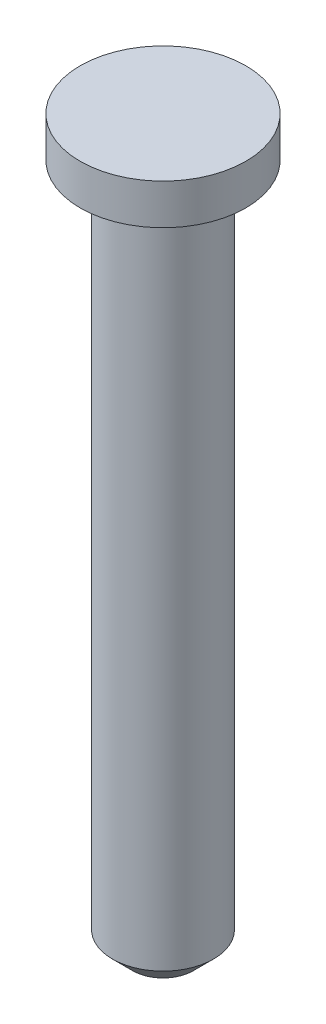
ISO-10303-21;
HEADER;
FILE_DESCRIPTION(('STEP AP214'),'2;1');
FILE_NAME('part.step','',(''),(''),'','','');
FILE_SCHEMA(('AUTOMOTIVE_DESIGN { 1 0 10303 214 1 1 1 1 }'));
ENDSEC;
DATA;
#1=APPLICATION_CONTEXT('core data for automotive mechanical design processes');
#2=APPLICATION_PROTOCOL_DEFINITION('international standard','automotive_design',2000,#1);
#3=PRODUCT_CONTEXT('',#1,'mechanical');
#4=PRODUCT('Part','Part','',(#3));
#5=PRODUCT_RELATED_PRODUCT_CATEGORY('part','',(#4));
#6=PRODUCT_DEFINITION_FORMATION('','',#4);
#7=PRODUCT_DEFINITION_CONTEXT('part definition',#1,'design');
#8=PRODUCT_DEFINITION('design','',#6,#7);
#9=PRODUCT_DEFINITION_SHAPE('','',#8);
#10=(LENGTH_UNIT() NAMED_UNIT(*) SI_UNIT(.MILLI.,.METRE.));
#11=(NAMED_UNIT(*) PLANE_ANGLE_UNIT() SI_UNIT($,.RADIAN.));
#12=(NAMED_UNIT(*) SI_UNIT($,.STERADIAN.) SOLID_ANGLE_UNIT());
#13=UNCERTAINTY_MEASURE_WITH_UNIT(LENGTH_MEASURE(1.E-05),#10,'distance_accuracy_value','');
#14=(GEOMETRIC_REPRESENTATION_CONTEXT(3) GLOBAL_UNCERTAINTY_ASSIGNED_CONTEXT((#13)) GLOBAL_UNIT_ASSIGNED_CONTEXT((#10,
#11,#12)) REPRESENTATION_CONTEXT('',''));
#15=CARTESIAN_POINT('',(0.,0.,0.));
#16=DIRECTION('',(0.,0.,1.));
#17=DIRECTION('',(1.,0.,0.));
#18=AXIS2_PLACEMENT_3D('',#15,#16,#17);
#19=CARTESIAN_POINT('',(0.,0.,0.));
#20=DIRECTION('',(0.,-1.,0.));
#21=DIRECTION('',(0.,0.,-1.));
#22=AXIS2_PLACEMENT_3D('',#19,#20,#21);
#23=PLANE('',#22);
#24=CARTESIAN_POINT('',(0.,0.,0.));
#25=DIRECTION('',(0.,1.,0.));
#26=DIRECTION('',(0.,0.,1.));
#27=AXIS2_PLACEMENT_3D('',#24,#25,#26);
#28=CIRCLE('',#27,2.05);
#29=CARTESIAN_POINT('',(0.,0.,2.05));
#30=VERTEX_POINT('',#29);
#31=EDGE_CURVE('E42',#30,#30,#28,.T.);
#32=ORIENTED_EDGE('',*,*,#31,.T.);
#33=EDGE_LOOP('',(#32));
#34=FACE_BOUND('',#33,.T.);
#35=ADVANCED_FACE('F31',(#34),#23,.F.);
#36=CARTESIAN_POINT('',(0.,0.,0.));
#37=DIRECTION('',(0.,1.,0.));
#38=DIRECTION('',(0.,0.,1.));
#39=AXIS2_PLACEMENT_3D('',#36,#37,#38);
#40=CYLINDRICAL_SURFACE('',#39,2.05);
#41=ORIENTED_EDGE('',*,*,#31,.F.);
#42=EDGE_LOOP('',(#41));
#43=FACE_BOUND('',#42,.T.);
#44=CARTESIAN_POINT('',(0.,-1.,0.));
#45=DIRECTION('',(0.,1.,0.));
#46=DIRECTION('',(0.,0.,1.));
#47=AXIS2_PLACEMENT_3D('',#44,#45,#46);
#48=CIRCLE('',#47,2.05);
#49=CARTESIAN_POINT('',(0.,-1.,2.05));
#50=VERTEX_POINT('',#49);
#51=EDGE_CURVE('E46',#50,#50,#48,.T.);
#52=ORIENTED_EDGE('',*,*,#51,.T.);
#53=EDGE_LOOP('',(#52));
#54=FACE_BOUND('',#53,.T.);
#55=ADVANCED_FACE('F66',(#43,#54),#40,.T.);
#56=CARTESIAN_POINT('',(2.05,-1.,0.));
#57=DIRECTION('',(0.,1.,0.));
#58=DIRECTION('',(0.,0.,1.));
#59=AXIS2_PLACEMENT_3D('',#56,#57,#58);
#60=PLANE('',#59);
#61=ORIENTED_EDGE('',*,*,#51,.F.);
#62=EDGE_LOOP('',(#61));
#63=FACE_BOUND('',#62,.T.);
#64=CARTESIAN_POINT('',(0.,-1.,0.));
#65=DIRECTION('',(0.,1.,0.));
#66=DIRECTION('',(0.,0.,1.));
#67=AXIS2_PLACEMENT_3D('',#64,#65,#66);
#68=CIRCLE('',#67,1.25);
#69=CARTESIAN_POINT('',(0.,-1.,1.25));
#70=VERTEX_POINT('',#69);
#71=EDGE_CURVE('E51',#70,#70,#68,.T.);
#72=ORIENTED_EDGE('',*,*,#71,.T.);
#73=EDGE_LOOP('',(#72));
#74=FACE_BOUND('',#73,.T.);
#75=ADVANCED_FACE('F55',(#63,#74),#60,.F.);
#76=CARTESIAN_POINT('',(0.,0.,0.));
#77=DIRECTION('',(0.,1.,0.));
#78=DIRECTION('',(0.,0.,1.));
#79=AXIS2_PLACEMENT_3D('',#76,#77,#78);
#80=CYLINDRICAL_SURFACE('',#79,1.25);
#81=CARTESIAN_POINT('',(0.,-17.5,0.));
#82=DIRECTION('',(0.,1.,0.));
#83=DIRECTION('',(0.,0.,1.));
#84=AXIS2_PLACEMENT_3D('',#81,#82,#83);
#85=CIRCLE('',#84,1.25);
#86=CARTESIAN_POINT('',(0.,-17.5,1.25));
#87=VERTEX_POINT('',#86);
#88=EDGE_CURVE('E38',#87,#87,#85,.T.);
#89=ORIENTED_EDGE('',*,*,#88,.T.);
#90=EDGE_LOOP('',(#89));
#91=FACE_BOUND('',#90,.T.);
#92=ORIENTED_EDGE('',*,*,#71,.F.);
#93=EDGE_LOOP('',(#92));
#94=FACE_BOUND('',#93,.T.);
#95=ADVANCED_FACE('F57',(#91,#94),#80,.T.);
#96=CARTESIAN_POINT('',(1.25,-18.,0.));
#97=DIRECTION('',(0.,1.,0.));
#98=DIRECTION('',(0.,0.,1.));
#99=AXIS2_PLACEMENT_3D('',#96,#97,#98);
#100=PLANE('',#99);
#101=CARTESIAN_POINT('',(0.,-18.,0.));
#102=DIRECTION('',(0.,1.,0.));
#103=DIRECTION('',(0.,0.,1.));
#104=AXIS2_PLACEMENT_3D('',#101,#102,#103);
#105=CIRCLE('',#104,0.749999999999997);
#106=CARTESIAN_POINT('',(0.,-18.,0.749999999999997));
#107=VERTEX_POINT('',#106);
#108=EDGE_CURVE('E10',#107,#107,#105,.F.);
#109=ORIENTED_EDGE('',*,*,#108,.T.);
#110=EDGE_LOOP('',(#109));
#111=FACE_BOUND('',#110,.T.);
#112=ADVANCED_FACE('F59',(#111),#100,.F.);
#113=CARTESIAN_POINT('',(0.,-17.5,0.));
#114=DIRECTION('',(0.,1.,0.));
#115=DIRECTION('',(0.,0.,1.));
#116=AXIS2_PLACEMENT_3D('',#113,#114,#115);
#117=CONICAL_SURFACE('',#116,1.25,0.785398163397452);
#118=ORIENTED_EDGE('',*,*,#108,.F.);
#119=EDGE_LOOP('',(#118));
#120=FACE_BOUND('',#119,.T.);
#121=ORIENTED_EDGE('',*,*,#88,.F.);
#122=EDGE_LOOP('',(#121));
#123=FACE_BOUND('',#122,.T.);
#124=ADVANCED_FACE('F33',(#120,#123),#117,.T.);
#125=CLOSED_SHELL('',(#35,#55,#75,#95,#112,#124));
#126=MANIFOLD_SOLID_BREP('B2',#125);
#127=ADVANCED_BREP_SHAPE_REPRESENTATION('',(#18,#126),#14);
#128=SHAPE_DEFINITION_REPRESENTATION(#9,#127);
ENDSEC;
END-ISO-10303-21;
